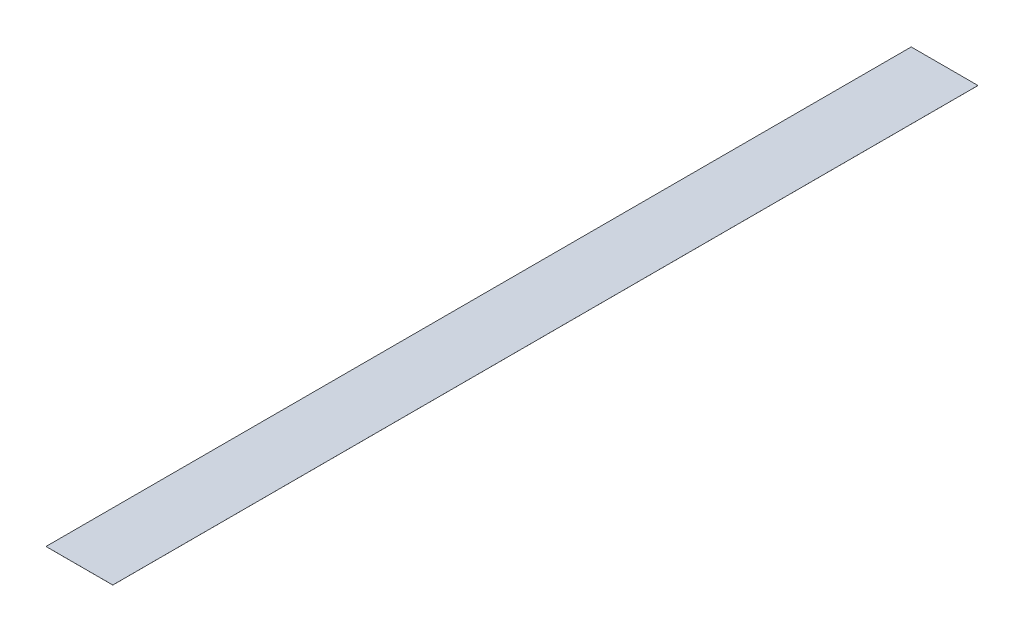
ISO-10303-21;
HEADER;
FILE_DESCRIPTION(('STEP AP214'),'2;1');
FILE_NAME('part.step','',(''),(''),'','','');
FILE_SCHEMA(('AUTOMOTIVE_DESIGN { 1 0 10303 214 1 1 1 1 }'));
ENDSEC;
DATA;
#1=APPLICATION_CONTEXT('core data for automotive mechanical design processes');
#2=APPLICATION_PROTOCOL_DEFINITION('international standard','automotive_design',2000,#1);
#3=PRODUCT_CONTEXT('',#1,'mechanical');
#4=PRODUCT('Part','Part','',(#3));
#5=PRODUCT_RELATED_PRODUCT_CATEGORY('part','',(#4));
#6=PRODUCT_DEFINITION_FORMATION('','',#4);
#7=PRODUCT_DEFINITION_CONTEXT('part definition',#1,'design');
#8=PRODUCT_DEFINITION('design','',#6,#7);
#9=PRODUCT_DEFINITION_SHAPE('','',#8);
#10=(LENGTH_UNIT() NAMED_UNIT(*) SI_UNIT(.MILLI.,.METRE.));
#11=(NAMED_UNIT(*) PLANE_ANGLE_UNIT() SI_UNIT($,.RADIAN.));
#12=(NAMED_UNIT(*) SI_UNIT($,.STERADIAN.) SOLID_ANGLE_UNIT());
#13=UNCERTAINTY_MEASURE_WITH_UNIT(LENGTH_MEASURE(1.E-05),#10,'distance_accuracy_value','');
#14=(GEOMETRIC_REPRESENTATION_CONTEXT(3) GLOBAL_UNCERTAINTY_ASSIGNED_CONTEXT((#13)) GLOBAL_UNIT_ASSIGNED_CONTEXT((#10,
#11,#12)) REPRESENTATION_CONTEXT('',''));
#15=CARTESIAN_POINT('',(0.,0.,0.));
#16=DIRECTION('',(0.,0.,1.));
#17=DIRECTION('',(1.,0.,0.));
#18=AXIS2_PLACEMENT_3D('',#15,#16,#17);
#19=CARTESIAN_POINT('',(-1829.70913443562,0.01,-664.752923734372));
#20=DIRECTION('',(0.,0.,-1.));
#21=DIRECTION('',(-1.,0.,0.));
#22=AXIS2_PLACEMENT_3D('',#19,#20,#21);
#23=PLANE('',#22);
#24=DIRECTION('',(1.,0.,0.));
#25=VECTOR('',#24,1.);
#26=CARTESIAN_POINT('',(-1829.70913443562,0.,-664.752923734372));
#27=LINE('',#26,#25);
#28=CARTESIAN_POINT('',(-1829.70913443562,0.,-664.752923734372));
#29=VERTEX_POINT('',#28);
#30=CARTESIAN_POINT('',(-1809.7091344356,0.,-664.752923734372));
#31=VERTEX_POINT('',#30);
#32=EDGE_CURVE('E110',#29,#31,#27,.T.);
#33=ORIENTED_EDGE('',*,*,#32,.F.);
#34=DIRECTION('',(0.,-1.,0.));
#35=VECTOR('',#34,1.);
#36=CARTESIAN_POINT('',(-1829.70913443562,0.01,-664.752923734372));
#37=LINE('',#36,#35);
#38=CARTESIAN_POINT('',(-1829.70913443562,0.01,-664.752923734372));
#39=VERTEX_POINT('',#38);
#40=EDGE_CURVE('E11',#39,#29,#37,.T.);
#41=ORIENTED_EDGE('',*,*,#40,.F.);
#42=DIRECTION('',(1.,0.,0.));
#43=VECTOR('',#42,1.);
#44=CARTESIAN_POINT('',(-1829.70913443562,0.01,-664.752923734372));
#45=LINE('',#44,#43);
#46=CARTESIAN_POINT('',(-1809.7091344356,0.01,-664.752923734372));
#47=VERTEX_POINT('',#46);
#48=EDGE_CURVE('E103',#39,#47,#45,.T.);
#49=ORIENTED_EDGE('',*,*,#48,.T.);
#50=DIRECTION('',(0.,-1.,0.));
#51=VECTOR('',#50,1.);
#52=CARTESIAN_POINT('',(-1809.7091344356,0.01,-664.752923734372));
#53=LINE('',#52,#51);
#54=EDGE_CURVE('E42',#47,#31,#53,.T.);
#55=ORIENTED_EDGE('',*,*,#54,.T.);
#56=EDGE_LOOP('',(#33,#41,#49,#55));
#57=FACE_BOUND('',#56,.T.);
#58=ADVANCED_FACE('F39',(#57),#23,.T.);
#59=CARTESIAN_POINT('',(-1829.70913443562,0.01,-664.752923734372));
#60=DIRECTION('',(1.,0.,0.));
#61=DIRECTION('',(0.,0.,-1.));
#62=AXIS2_PLACEMENT_3D('',#59,#60,#61);
#63=PLANE('',#62);
#64=DIRECTION('',(0.,0.,1.));
#65=VECTOR('',#64,1.);
#66=CARTESIAN_POINT('',(-1829.70913443562,0.,-664.752923734372));
#67=LINE('',#66,#65);
#68=CARTESIAN_POINT('',(-1829.70913443561,0.,-405.674374077961));
#69=VERTEX_POINT('',#68);
#70=EDGE_CURVE('E73',#29,#69,#67,.T.);
#71=ORIENTED_EDGE('',*,*,#70,.T.);
#72=DIRECTION('',(0.,-1.,0.));
#73=VECTOR('',#72,1.);
#74=CARTESIAN_POINT('',(-1829.70913443561,0.01,-405.674374077961));
#75=LINE('',#74,#73);
#76=CARTESIAN_POINT('',(-1829.70913443561,0.01,-405.674374077961));
#77=VERTEX_POINT('',#76);
#78=EDGE_CURVE('E49',#77,#69,#75,.T.);
#79=ORIENTED_EDGE('',*,*,#78,.F.);
#80=DIRECTION('',(0.,0.,1.));
#81=VECTOR('',#80,1.);
#82=CARTESIAN_POINT('',(-1829.70913443562,0.01,-664.752923734372));
#83=LINE('',#82,#81);
#84=EDGE_CURVE('E90',#39,#77,#83,.T.);
#85=ORIENTED_EDGE('',*,*,#84,.F.);
#86=ORIENTED_EDGE('',*,*,#40,.T.);
#87=EDGE_LOOP('',(#71,#79,#85,#86));
#88=FACE_BOUND('',#87,.T.);
#89=ADVANCED_FACE('F126',(#88),#63,.F.);
#90=CARTESIAN_POINT('',(-1829.70913443561,0.01,-405.674374077961));
#91=DIRECTION('',(0.,0.,-1.));
#92=DIRECTION('',(-1.,0.,0.));
#93=AXIS2_PLACEMENT_3D('',#90,#91,#92);
#94=PLANE('',#93);
#95=DIRECTION('',(1.,0.,0.));
#96=VECTOR('',#95,1.);
#97=CARTESIAN_POINT('',(-1829.70913443561,0.,-405.674374077961));
#98=LINE('',#97,#96);
#99=CARTESIAN_POINT('',(-1809.70913443561,0.,-405.674374077961));
#100=VERTEX_POINT('',#99);
#101=EDGE_CURVE('E98',#69,#100,#98,.T.);
#102=ORIENTED_EDGE('',*,*,#101,.T.);
#103=DIRECTION('',(0.,-1.,0.));
#104=VECTOR('',#103,1.);
#105=CARTESIAN_POINT('',(-1809.70913443561,0.01,-405.674374077961));
#106=LINE('',#105,#104);
#107=CARTESIAN_POINT('',(-1809.70913443561,0.01,-405.674374077961));
#108=VERTEX_POINT('',#107);
#109=EDGE_CURVE('E95',#108,#100,#106,.T.);
#110=ORIENTED_EDGE('',*,*,#109,.F.);
#111=DIRECTION('',(1.,0.,0.));
#112=VECTOR('',#111,1.);
#113=CARTESIAN_POINT('',(-1829.70913443561,0.01,-405.674374077961));
#114=LINE('',#113,#112);
#115=EDGE_CURVE('E85',#77,#108,#114,.T.);
#116=ORIENTED_EDGE('',*,*,#115,.F.);
#117=ORIENTED_EDGE('',*,*,#78,.T.);
#118=EDGE_LOOP('',(#102,#110,#116,#117));
#119=FACE_BOUND('',#118,.T.);
#120=ADVANCED_FACE('F96',(#119),#94,.F.);
#121=CARTESIAN_POINT('',(-1809.7091344356,0.01,-664.752923734372));
#122=DIRECTION('',(1.,0.,0.));
#123=DIRECTION('',(0.,0.,-1.));
#124=AXIS2_PLACEMENT_3D('',#121,#122,#123);
#125=PLANE('',#124);
#126=DIRECTION('',(0.,0.,1.));
#127=VECTOR('',#126,1.);
#128=CARTESIAN_POINT('',(-1809.7091344356,0.,-664.752923734372));
#129=LINE('',#128,#127);
#130=EDGE_CURVE('E114',#31,#100,#129,.T.);
#131=ORIENTED_EDGE('',*,*,#130,.F.);
#132=ORIENTED_EDGE('',*,*,#54,.F.);
#133=DIRECTION('',(0.,0.,1.));
#134=VECTOR('',#133,1.);
#135=CARTESIAN_POINT('',(-1809.7091344356,0.01,-664.752923734372));
#136=LINE('',#135,#134);
#137=EDGE_CURVE('E89',#47,#108,#136,.T.);
#138=ORIENTED_EDGE('',*,*,#137,.T.);
#139=ORIENTED_EDGE('',*,*,#109,.T.);
#140=EDGE_LOOP('',(#131,#132,#138,#139));
#141=FACE_BOUND('',#140,.T.);
#142=ADVANCED_FACE('F101',(#141),#125,.T.);
#143=CARTESIAN_POINT('',(0.,0.01,0.));
#144=DIRECTION('',(0.,-1.,0.));
#145=DIRECTION('',(0.,0.,-1.));
#146=AXIS2_PLACEMENT_3D('',#143,#144,#145);
#147=PLANE('',#146);
#148=ORIENTED_EDGE('',*,*,#48,.F.);
#149=ORIENTED_EDGE('',*,*,#84,.T.);
#150=ORIENTED_EDGE('',*,*,#115,.T.);
#151=ORIENTED_EDGE('',*,*,#137,.F.);
#152=EDGE_LOOP('',(#148,#149,#150,#151));
#153=FACE_BOUND('',#152,.T.);
#154=ADVANCED_FACE('F88',(#153),#147,.F.);
#155=CARTESIAN_POINT('',(0.,0.,0.));
#156=DIRECTION('',(0.,-1.,0.));
#157=DIRECTION('',(0.,0.,-1.));
#158=AXIS2_PLACEMENT_3D('',#155,#156,#157);
#159=PLANE('',#158);
#160=ORIENTED_EDGE('',*,*,#32,.T.);
#161=ORIENTED_EDGE('',*,*,#130,.T.);
#162=ORIENTED_EDGE('',*,*,#101,.F.);
#163=ORIENTED_EDGE('',*,*,#70,.F.);
#164=EDGE_LOOP('',(#160,#161,#162,#163));
#165=FACE_BOUND('',#164,.T.);
#166=ADVANCED_FACE('F123',(#165),#159,.T.);
#167=CLOSED_SHELL('',(#58,#89,#120,#142,#154,#166));
#168=MANIFOLD_SOLID_BREP('B2',#167);
#169=ADVANCED_BREP_SHAPE_REPRESENTATION('',(#18,#168),#14);
#170=SHAPE_DEFINITION_REPRESENTATION(#9,#169);
ENDSEC;
END-ISO-10303-21;
